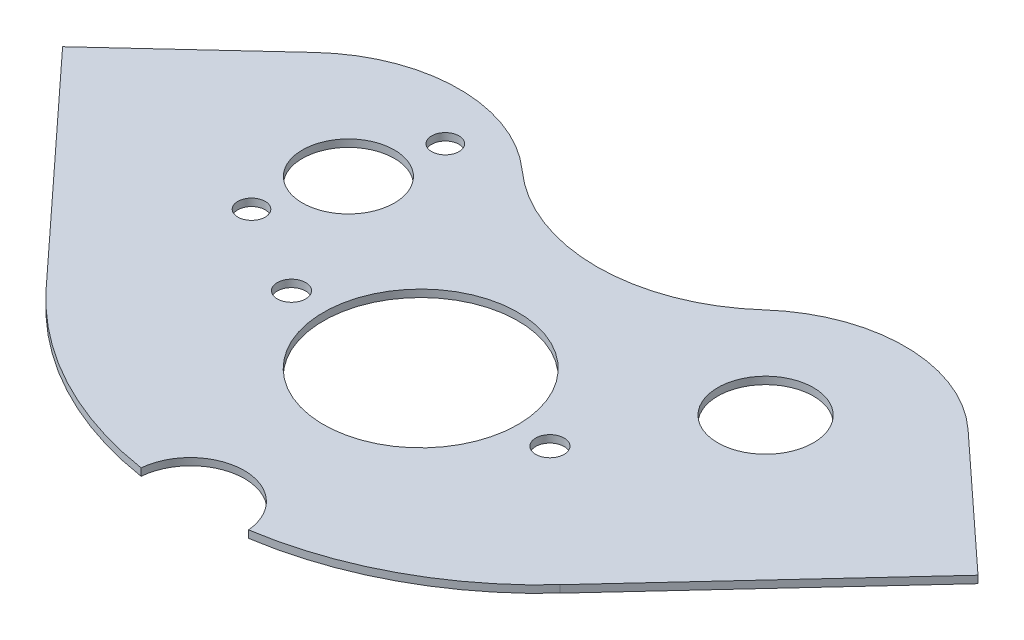
ISO-10303-21;
HEADER;
FILE_DESCRIPTION(('STEP AP214'),'2;1');
FILE_NAME('part.step','',(''),(''),'','','');
FILE_SCHEMA(('AUTOMOTIVE_DESIGN { 1 0 10303 214 1 1 1 1 }'));
ENDSEC;
DATA;
#1=APPLICATION_CONTEXT('core data for automotive mechanical design processes');
#2=APPLICATION_PROTOCOL_DEFINITION('international standard','automotive_design',2000,#1);
#3=PRODUCT_CONTEXT('',#1,'mechanical');
#4=PRODUCT('Part','Part','',(#3));
#5=PRODUCT_RELATED_PRODUCT_CATEGORY('part','',(#4));
#6=PRODUCT_DEFINITION_FORMATION('','',#4);
#7=PRODUCT_DEFINITION_CONTEXT('part definition',#1,'design');
#8=PRODUCT_DEFINITION('design','',#6,#7);
#9=PRODUCT_DEFINITION_SHAPE('','',#8);
#10=(LENGTH_UNIT() NAMED_UNIT(*) SI_UNIT(.MILLI.,.METRE.));
#11=(NAMED_UNIT(*) PLANE_ANGLE_UNIT() SI_UNIT($,.RADIAN.));
#12=(NAMED_UNIT(*) SI_UNIT($,.STERADIAN.) SOLID_ANGLE_UNIT());
#13=UNCERTAINTY_MEASURE_WITH_UNIT(LENGTH_MEASURE(1.E-05),#10,'distance_accuracy_value','');
#14=(GEOMETRIC_REPRESENTATION_CONTEXT(3) GLOBAL_UNCERTAINTY_ASSIGNED_CONTEXT((#13)) GLOBAL_UNIT_ASSIGNED_CONTEXT((#10,
#11,#12)) REPRESENTATION_CONTEXT('',''));
#15=CARTESIAN_POINT('',(0.,0.,0.));
#16=DIRECTION('',(0.,0.,1.));
#17=DIRECTION('',(1.,0.,0.));
#18=AXIS2_PLACEMENT_3D('',#15,#16,#17);
#19=CARTESIAN_POINT('',(-53.8377327101962,0.,-81.7271601363231));
#20=DIRECTION('',(0.,-1.,0.));
#21=DIRECTION('',(0.,0.,-1.));
#22=AXIS2_PLACEMENT_3D('',#19,#20,#21);
#23=PLANE('',#22);
#24=CARTESIAN_POINT('',(-44.0412566940763,0.,-105.547587553228));
#25=DIRECTION('',(0.,-1.,0.));
#26=DIRECTION('',(0.,0.,-1.));
#27=AXIS2_PLACEMENT_3D('',#24,#25,#26);
#28=CIRCLE('',#27,3.30200000000001);
#29=CARTESIAN_POINT('',(-44.0412566940763,0.,-108.849587553228));
#30=VERTEX_POINT('',#29);
#31=EDGE_CURVE('E539',#30,#30,#28,.T.);
#32=ORIENTED_EDGE('',*,*,#31,.F.);
#33=EDGE_LOOP('',(#32));
#34=FACE_BOUND('',#33,.T.);
#35=CARTESIAN_POINT('',(-31.8702602118754,0.,-56.2179716068308));
#36=DIRECTION('',(0.,-1.,0.));
#37=DIRECTION('',(0.,0.,-1.));
#38=AXIS2_PLACEMENT_3D('',#35,#36,#37);
#39=CIRCLE('',#38,3.42899999999999);
#40=CARTESIAN_POINT('',(-31.8702602118754,0.,-59.6469716068308));
#41=VERTEX_POINT('',#40);
#42=EDGE_CURVE('E196',#41,#41,#39,.F.);
#43=ORIENTED_EDGE('',*,*,#42,.T.);
#44=EDGE_LOOP('',(#43));
#45=FACE_BOUND('',#44,.T.);
#46=CARTESIAN_POINT('',(0.,0.,-55.5625));
#47=DIRECTION('',(0.,1.,0.));
#48=DIRECTION('',(1.,0.,0.));
#49=AXIS2_PLACEMENT_3D('',#46,#47,#48);
#50=CIRCLE('',#49,23.495);
#51=CARTESIAN_POINT('',(23.495,0.,-55.5625));
#52=VERTEX_POINT('',#51);
#53=EDGE_CURVE('E131',#52,#52,#50,.T.);
#54=ORIENTED_EDGE('',*,*,#53,.T.);
#55=EDGE_LOOP('',(#54));
#56=FACE_BOUND('',#55,.T.);
#57=CARTESIAN_POINT('',(0.,0.,0.0228184233947739));
#58=DIRECTION('',(0.,-1.,0.));
#59=DIRECTION('',(0.,0.,-1.));
#60=AXIS2_PLACEMENT_3D('',#57,#58,#59);
#61=ELLIPSE('',#60,13.0403184233948,13.0175);
#62=CARTESIAN_POINT('',(-12.977150257409,0.,-1.00312398810599));
#63=VERTEX_POINT('',#62);
#64=CARTESIAN_POINT('',(12.9772534174101,0.,-1.00181369621306));
#65=VERTEX_POINT('',#64);
#66=EDGE_CURVE('E163',#63,#65,#61,.T.);
#67=ORIENTED_EDGE('',*,*,#66,.F.);
#68=CARTESIAN_POINT('',(0.00426678692969085,0.,-84.4977440571273));
#69=DIRECTION('',(0.,-1.,0.));
#70=DIRECTION('',(1.,0.,0.));
#71=AXIS2_PLACEMENT_3D('',#68,#69,#70);
#72=CIRCLE('',#71,84.4977441648549);
#73=CARTESIAN_POINT('',(-62.0509434836258,0.,-27.147768928742));
#74=VERTEX_POINT('',#73);
#75=EDGE_CURVE('E154',#63,#74,#72,.T.);
#76=ORIENTED_EDGE('',*,*,#75,.T.);
#77=DIRECTION('',(-0.678819706413153,0.,-0.734304981724325));
#78=VECTOR('',#77,1.);
#79=CARTESIAN_POINT('',(-110.561503513838,0.,-79.6234786936275));
#80=LINE('',#79,#78);
#81=CARTESIAN_POINT('',(-110.561503513838,0.,-79.6234786936275));
#82=VERTEX_POINT('',#81);
#83=EDGE_CURVE('E157',#74,#82,#80,.T.);
#84=ORIENTED_EDGE('',*,*,#83,.T.);
#85=DIRECTION('',(0.734359649141192,0.,-0.678760565820691));
#86=VECTOR('',#85,1.);
#87=CARTESIAN_POINT('',(-110.561503513838,0.,-79.6234786936275));
#88=LINE('',#87,#86);
#89=CARTESIAN_POINT('',(-78.9226869412316,0.,-108.866889689634));
#90=VERTEX_POINT('',#89);
#91=EDGE_CURVE('E139',#82,#90,#88,.T.);
#92=ORIENTED_EDGE('',*,*,#91,.T.);
#93=CARTESIAN_POINT('',(-53.8377327101962,0.,-81.7271601363231));
#94=DIRECTION('',(0.,-1.,0.));
#95=DIRECTION('',(1.,0.,0.));
#96=AXIS2_PLACEMENT_3D('',#93,#94,#95);
#97=CIRCLE('',#96,36.957);
#98=CARTESIAN_POINT('',(-29.1885942519924,0.,-109.263314956274));
#99=VERTEX_POINT('',#98);
#100=EDGE_CURVE('E134',#90,#99,#97,.T.);
#101=ORIENTED_EDGE('',*,*,#100,.T.);
#102=CARTESIAN_POINT('',(0.,0.,-141.870606755233));
#103=DIRECTION('',(0.,1.,0.));
#104=DIRECTION('',(1.,0.,0.));
#105=AXIS2_PLACEMENT_3D('',#102,#103,#104);
#106=CIRCLE('',#105,43.7631067552326);
#107=CARTESIAN_POINT('',(29.1885942519924,0.,-109.263314956274));
#108=VERTEX_POINT('',#107);
#109=EDGE_CURVE('E138',#99,#108,#106,.T.);
#110=ORIENTED_EDGE('',*,*,#109,.T.);
#111=CARTESIAN_POINT('',(53.8377327101962,0.,-81.7271601363231));
#112=DIRECTION('',(0.,-1.,0.));
#113=DIRECTION('',(1.,0.,0.));
#114=AXIS2_PLACEMENT_3D('',#111,#112,#113);
#115=CIRCLE('',#114,36.957);
#116=CARTESIAN_POINT('',(78.9226869412315,0.,-108.866889689634));
#117=VERTEX_POINT('',#116);
#118=EDGE_CURVE('E143',#108,#117,#115,.T.);
#119=ORIENTED_EDGE('',*,*,#118,.T.);
#120=DIRECTION('',(0.734359649141192,0.,0.678760565820691));
#121=VECTOR('',#120,1.);
#122=CARTESIAN_POINT('',(110.561879070579,0.,-79.6231315706523));
#123=LINE('',#122,#121);
#124=CARTESIAN_POINT('',(110.561879070579,0.,-79.6231315706523));
#125=VERTEX_POINT('',#124);
#126=EDGE_CURVE('E147',#117,#125,#123,.T.);
#127=ORIENTED_EDGE('',*,*,#126,.T.);
#128=DIRECTION('',(-0.678760565820691,0.,0.734359649141193));
#129=VECTOR('',#128,1.);
#130=CARTESIAN_POINT('',(62.053684867492,0.,-27.1415021578113));
#131=LINE('',#130,#129);
#132=CARTESIAN_POINT('',(62.053684867492,0.,-27.1415021578113));
#133=VERTEX_POINT('',#132);
#134=EDGE_CURVE('E151',#125,#133,#131,.T.);
#135=ORIENTED_EDGE('',*,*,#134,.T.);
#136=EDGE_CURVE('E103',#133,#65,#72,.T.);
#137=ORIENTED_EDGE('',*,*,#136,.T.);
#138=EDGE_LOOP('',(#67,#76,#84,#92,#101,#110,#119,#127,#135,#137));
#139=FACE_BOUND('',#138,.T.);
#140=CARTESIAN_POINT('',(-48.8950000000001,0.,-86.9949999999999));
#141=DIRECTION('',(0.,-1.,0.));
#142=DIRECTION('',(1.,0.,0.));
#143=AXIS2_PLACEMENT_3D('',#140,#141,#142);
#144=CIRCLE('',#143,11.1125);
#145=CARTESIAN_POINT('',(-37.7825000000001,0.,-86.9949999999999));
#146=VERTEX_POINT('',#145);
#147=EDGE_CURVE('E201',#146,#146,#144,.T.);
#148=ORIENTED_EDGE('',*,*,#147,.F.);
#149=EDGE_LOOP('',(#148));
#150=FACE_BOUND('',#149,.T.);
#151=CARTESIAN_POINT('',(51.4349999999999,0.,-87.4395000000001));
#152=DIRECTION('',(0.,-1.,0.));
#153=DIRECTION('',(1.,0.,0.));
#154=AXIS2_PLACEMENT_3D('',#151,#152,#153);
#155=CIRCLE('',#154,11.557);
#156=CARTESIAN_POINT('',(62.9919999999999,0.,-87.4395000000001));
#157=VERTEX_POINT('',#156);
#158=EDGE_CURVE('E179',#157,#157,#155,.T.);
#159=ORIENTED_EDGE('',*,*,#158,.F.);
#160=EDGE_LOOP('',(#159));
#161=FACE_BOUND('',#160,.T.);
#162=CARTESIAN_POINT('',(31.8702602118752,0.,-54.9070283931695));
#163=DIRECTION('',(0.,1.,0.));
#164=DIRECTION('',(1.,0.,0.));
#165=AXIS2_PLACEMENT_3D('',#162,#163,#164);
#166=CIRCLE('',#165,3.42900000000003);
#167=CARTESIAN_POINT('',(35.2992602118752,0.,-54.9070283931695));
#168=VERTEX_POINT('',#167);
#169=EDGE_CURVE('E180',#168,#168,#166,.T.);
#170=ORIENTED_EDGE('',*,*,#169,.T.);
#171=EDGE_LOOP('',(#170));
#172=FACE_BOUND('',#171,.T.);
#173=CARTESIAN_POINT('',(-53.748743305924,0.,-68.4424124467718));
#174=DIRECTION('',(0.,-1.,0.));
#175=DIRECTION('',(0.,0.,-1.));
#176=AXIS2_PLACEMENT_3D('',#173,#174,#175);
#177=CIRCLE('',#176,3.30200000000001);
#178=CARTESIAN_POINT('',(-53.748743305924,0.,-71.7444124467718));
#179=VERTEX_POINT('',#178);
#180=EDGE_CURVE('E550',#179,#179,#177,.F.);
#181=ORIENTED_EDGE('',*,*,#180,.T.);
#182=EDGE_LOOP('',(#181));
#183=FACE_BOUND('',#182,.T.);
#184=ADVANCED_FACE('F15',(#34,#45,#56,#139,#150,#161,#172,#183),#23,.T.);
#185=CARTESIAN_POINT('',(-53.8377327101962,1.778,-81.7271601363231));
#186=DIRECTION('',(0.,-1.,0.));
#187=DIRECTION('',(0.,0.,-1.));
#188=AXIS2_PLACEMENT_3D('',#185,#186,#187);
#189=PLANE('',#188);
#190=CARTESIAN_POINT('',(-44.0412566940763,1.778,-105.547587553228));
#191=DIRECTION('',(0.,1.,0.));
#192=DIRECTION('',(0.678819706413153,0.,0.734304981724325));
#193=AXIS2_PLACEMENT_3D('',#190,#191,#192);
#194=CIRCLE('',#193,3.30200000000001);
#195=CARTESIAN_POINT('',(-41.7997940235,1.778,-103.122912503575));
#196=VERTEX_POINT('',#195);
#197=EDGE_CURVE('E542',#196,#196,#194,.T.);
#198=ORIENTED_EDGE('',*,*,#197,.F.);
#199=EDGE_LOOP('',(#198));
#200=FACE_BOUND('',#199,.T.);
#201=CARTESIAN_POINT('',(31.8702602118752,1.778,-54.9070283931695));
#202=DIRECTION('',(0.,-1.,0.));
#203=DIRECTION('',(0.,0.,-1.));
#204=AXIS2_PLACEMENT_3D('',#201,#202,#203);
#205=CIRCLE('',#204,3.42900000000003);
#206=CARTESIAN_POINT('',(31.8702602118752,1.778,-58.3360283931695));
#207=VERTEX_POINT('',#206);
#208=EDGE_CURVE('E177',#207,#207,#205,.F.);
#209=ORIENTED_EDGE('',*,*,#208,.F.);
#210=EDGE_LOOP('',(#209));
#211=FACE_BOUND('',#210,.T.);
#212=CARTESIAN_POINT('',(51.4349999999999,1.778,-87.4395000000001));
#213=DIRECTION('',(0.,-1.,0.));
#214=DIRECTION('',(1.,0.,0.));
#215=AXIS2_PLACEMENT_3D('',#212,#213,#214);
#216=CIRCLE('',#215,11.557);
#217=CARTESIAN_POINT('',(62.9919999999999,1.778,-87.4395000000001));
#218=VERTEX_POINT('',#217);
#219=EDGE_CURVE('E185',#218,#218,#216,.T.);
#220=ORIENTED_EDGE('',*,*,#219,.T.);
#221=EDGE_LOOP('',(#220));
#222=FACE_BOUND('',#221,.T.);
#223=CARTESIAN_POINT('',(-48.8950000000001,1.778,-86.9949999999999));
#224=DIRECTION('',(0.,-1.,0.));
#225=DIRECTION('',(1.,0.,0.));
#226=AXIS2_PLACEMENT_3D('',#223,#224,#225);
#227=CIRCLE('',#226,11.1125);
#228=CARTESIAN_POINT('',(-37.7825000000001,1.778,-86.9949999999999));
#229=VERTEX_POINT('',#228);
#230=EDGE_CURVE('E203',#229,#229,#227,.T.);
#231=ORIENTED_EDGE('',*,*,#230,.T.);
#232=EDGE_LOOP('',(#231));
#233=FACE_BOUND('',#232,.T.);
#234=CARTESIAN_POINT('',(0.00426678692969085,1.778,-84.4977440571273));
#235=DIRECTION('',(0.,-1.,0.));
#236=DIRECTION('',(1.,0.,0.));
#237=AXIS2_PLACEMENT_3D('',#234,#235,#236);
#238=CIRCLE('',#237,84.4977441648549);
#239=CARTESIAN_POINT('',(-12.9685403528648,1.778,-1.0017858084614));
#240=VERTEX_POINT('',#239);
#241=CARTESIAN_POINT('',(-62.0509434836258,1.778,-27.147768928742));
#242=VERTEX_POINT('',#241);
#243=EDGE_CURVE('E116',#240,#242,#238,.T.);
#244=ORIENTED_EDGE('',*,*,#243,.F.);
#245=CARTESIAN_POINT('',(0.,1.778,0.128139675640387));
#246=DIRECTION('',(0.,-1.,0.));
#247=DIRECTION('',(0.,0.,-1.));
#248=AXIS2_PLACEMENT_3D('',#245,#246,#247);
#249=ELLIPSE('',#248,13.0403184233948,13.0175);
#250=CARTESIAN_POINT('',(12.968653834394,1.778,-1.00047800947277));
#251=VERTEX_POINT('',#250);
#252=EDGE_CURVE('E9',#240,#251,#249,.T.);
#253=ORIENTED_EDGE('',*,*,#252,.T.);
#254=CARTESIAN_POINT('',(62.053684867492,1.778,-27.1415021578113));
#255=VERTEX_POINT('',#254);
#256=EDGE_CURVE('E101',#255,#251,#238,.T.);
#257=ORIENTED_EDGE('',*,*,#256,.F.);
#258=DIRECTION('',(-0.678760565820691,0.,0.734359649141193));
#259=VECTOR('',#258,1.);
#260=CARTESIAN_POINT('',(62.053684867492,1.778,-27.1415021578113));
#261=LINE('',#260,#259);
#262=CARTESIAN_POINT('',(110.561879070579,1.778,-79.6231315706523));
#263=VERTEX_POINT('',#262);
#264=EDGE_CURVE('E111',#263,#255,#261,.T.);
#265=ORIENTED_EDGE('',*,*,#264,.F.);
#266=DIRECTION('',(0.734359649141192,0.,0.678760565820691));
#267=VECTOR('',#266,1.);
#268=CARTESIAN_POINT('',(110.561879070579,1.778,-79.6231315706523));
#269=LINE('',#268,#267);
#270=CARTESIAN_POINT('',(78.9226869412315,1.778,-108.866889689634));
#271=VERTEX_POINT('',#270);
#272=EDGE_CURVE('E117',#271,#263,#269,.T.);
#273=ORIENTED_EDGE('',*,*,#272,.F.);
#274=CARTESIAN_POINT('',(53.8377327101962,1.778,-81.7271601363231));
#275=DIRECTION('',(0.,-1.,0.));
#276=DIRECTION('',(1.,0.,0.));
#277=AXIS2_PLACEMENT_3D('',#274,#275,#276);
#278=CIRCLE('',#277,36.957);
#279=CARTESIAN_POINT('',(29.1885942519924,1.778,-109.263314956274));
#280=VERTEX_POINT('',#279);
#281=EDGE_CURVE('E266',#280,#271,#278,.T.);
#282=ORIENTED_EDGE('',*,*,#281,.F.);
#283=CARTESIAN_POINT('',(0.,1.778,-141.870606755233));
#284=DIRECTION('',(0.,1.,0.));
#285=DIRECTION('',(1.,0.,0.));
#286=AXIS2_PLACEMENT_3D('',#283,#284,#285);
#287=CIRCLE('',#286,43.7631067552326);
#288=CARTESIAN_POINT('',(-29.1885942519924,1.778,-109.263314956274));
#289=VERTEX_POINT('',#288);
#290=EDGE_CURVE('E260',#289,#280,#287,.T.);
#291=ORIENTED_EDGE('',*,*,#290,.F.);
#292=CARTESIAN_POINT('',(-53.8377327101962,1.778,-81.7271601363231));
#293=DIRECTION('',(0.,-1.,0.));
#294=DIRECTION('',(1.,0.,0.));
#295=AXIS2_PLACEMENT_3D('',#292,#293,#294);
#296=CIRCLE('',#295,36.957);
#297=CARTESIAN_POINT('',(-78.9226869412316,1.778,-108.866889689634));
#298=VERTEX_POINT('',#297);
#299=EDGE_CURVE('E130',#298,#289,#296,.T.);
#300=ORIENTED_EDGE('',*,*,#299,.F.);
#301=DIRECTION('',(0.734359649141192,0.,-0.678760565820691));
#302=VECTOR('',#301,1.);
#303=CARTESIAN_POINT('',(-110.561503513838,1.778,-79.6234786936275));
#304=LINE('',#303,#302);
#305=CARTESIAN_POINT('',(-110.561503513838,1.778,-79.6234786936275));
#306=VERTEX_POINT('',#305);
#307=EDGE_CURVE('E128',#306,#298,#304,.T.);
#308=ORIENTED_EDGE('',*,*,#307,.F.);
#309=DIRECTION('',(-0.678819706413153,0.,-0.734304981724325));
#310=VECTOR('',#309,1.);
#311=CARTESIAN_POINT('',(-110.561503513838,1.778,-79.6234786936275));
#312=LINE('',#311,#310);
#313=EDGE_CURVE('E122',#242,#306,#312,.T.);
#314=ORIENTED_EDGE('',*,*,#313,.F.);
#315=EDGE_LOOP('',(#244,#253,#257,#265,#273,#282,#291,#300,#308,#314));
#316=FACE_BOUND('',#315,.T.);
#317=CARTESIAN_POINT('',(0.,1.778,-55.5625));
#318=DIRECTION('',(0.,1.,0.));
#319=DIRECTION('',(1.,0.,0.));
#320=AXIS2_PLACEMENT_3D('',#317,#318,#319);
#321=CIRCLE('',#320,23.495);
#322=CARTESIAN_POINT('',(23.495,1.778,-55.5625));
#323=VERTEX_POINT('',#322);
#324=EDGE_CURVE('E124',#323,#323,#321,.T.);
#325=ORIENTED_EDGE('',*,*,#324,.F.);
#326=EDGE_LOOP('',(#325));
#327=FACE_BOUND('',#326,.T.);
#328=CARTESIAN_POINT('',(-31.8702602118754,1.778,-56.2179716068308));
#329=DIRECTION('',(0.,-1.,0.));
#330=DIRECTION('',(0.,0.,-1.));
#331=AXIS2_PLACEMENT_3D('',#328,#329,#330);
#332=CIRCLE('',#331,3.42899999999999);
#333=CARTESIAN_POINT('',(-31.8702602118754,1.778,-59.6469716068308));
#334=VERTEX_POINT('',#333);
#335=EDGE_CURVE('E19',#334,#334,#332,.T.);
#336=ORIENTED_EDGE('',*,*,#335,.T.);
#337=EDGE_LOOP('',(#336));
#338=FACE_BOUND('',#337,.T.);
#339=CARTESIAN_POINT('',(-53.748743305924,1.778,-68.4424124467718));
#340=DIRECTION('',(0.,-1.,0.));
#341=DIRECTION('',(0.678819706413153,0.,0.734304981724325));
#342=AXIS2_PLACEMENT_3D('',#339,#340,#341);
#343=CIRCLE('',#342,3.30200000000001);
#344=CARTESIAN_POINT('',(-51.5072806353478,1.778,-66.017737397118));
#345=VERTEX_POINT('',#344);
#346=EDGE_CURVE('E546',#345,#345,#343,.T.);
#347=ORIENTED_EDGE('',*,*,#346,.T.);
#348=EDGE_LOOP('',(#347));
#349=FACE_BOUND('',#348,.T.);
#350=ADVANCED_FACE('F120',(#200,#211,#222,#233,#316,#327,#338,#349),#189,.F.);
#351=CARTESIAN_POINT('',(0.00426678692969085,1.778,-84.4977440571273));
#352=DIRECTION('',(0.,-1.,0.));
#353=DIRECTION('',(0.,0.,-1.));
#354=AXIS2_PLACEMENT_3D('',#351,#352,#353);
#355=CYLINDRICAL_SURFACE('',#354,84.4977441648549);
#356=CARTESIAN_POINT('',(-12.9685403528648,1.778,-1.0017858084614));
#357=CARTESIAN_POINT('',(-12.9700441449491,1.48166700785893,-1.00201945699263));
#358=CARTESIAN_POINT('',(-12.9715135330366,1.18533384512172,-1.00224779622862));
#359=CARTESIAN_POINT('',(-12.974383501218,0.592667178455057,-1.00269385611015));
#360=CARTESIAN_POINT('',(-12.9757840813119,0.296333674525594,-1.00291157675568));
#361=CARTESIAN_POINT('',(-12.977150257409,0.,-1.00312398810598));
#362=B_SPLINE_CURVE_WITH_KNOTS('',3,(#356,#357,#358,#359,#360,#361),.UNSPECIFIED.,.F.,.F.,(4,2,
4),(0.,0.889010681151768,1.77802136230354),.UNSPECIFIED.);
#363=EDGE_CURVE('E215',#240,#63,#362,.T.);
#364=ORIENTED_EDGE('',*,*,#363,.F.);
#365=ORIENTED_EDGE('',*,*,#243,.T.);
#366=DIRECTION('',(0.,-1.,0.));
#367=VECTOR('',#366,1.);
#368=CARTESIAN_POINT('',(-62.0509434836258,1.778,-27.147768928742));
#369=LINE('',#368,#367);
#370=EDGE_CURVE('E108',#242,#74,#369,.T.);
#371=ORIENTED_EDGE('',*,*,#370,.T.);
#372=ORIENTED_EDGE('',*,*,#75,.F.);
#373=EDGE_LOOP('',(#364,#365,#371,#372));
#374=FACE_BOUND('',#373,.T.);
#375=ADVANCED_FACE('F234',(#374),#355,.T.);
#376=CARTESIAN_POINT('',(-110.561503513838,1.778,-79.6234786936275));
#377=DIRECTION('',(-0.678760565820691,0.,-0.734359649141192));
#378=DIRECTION('',(-0.734359649141192,0.,0.678760565820691));
#379=AXIS2_PLACEMENT_3D('',#376,#377,#378);
#380=PLANE('',#379);
#381=ORIENTED_EDGE('',*,*,#91,.F.);
#382=DIRECTION('',(0.,-1.,0.));
#383=VECTOR('',#382,1.);
#384=CARTESIAN_POINT('',(-110.561503513838,1.778,-79.6234786936275));
#385=LINE('',#384,#383);
#386=EDGE_CURVE('E40',#306,#82,#385,.T.);
#387=ORIENTED_EDGE('',*,*,#386,.F.);
#388=ORIENTED_EDGE('',*,*,#307,.T.);
#389=DIRECTION('',(0.,-1.,0.));
#390=VECTOR('',#389,1.);
#391=CARTESIAN_POINT('',(-78.9226869412316,1.778,-108.866889689634));
#392=LINE('',#391,#390);
#393=EDGE_CURVE('E24',#298,#90,#392,.T.);
#394=ORIENTED_EDGE('',*,*,#393,.T.);
#395=EDGE_LOOP('',(#381,#387,#388,#394));
#396=FACE_BOUND('',#395,.T.);
#397=ADVANCED_FACE('F17',(#396),#380,.T.);
#398=CARTESIAN_POINT('',(-53.8377327101962,1.778,-81.7271601363231));
#399=DIRECTION('',(0.,-1.,0.));
#400=DIRECTION('',(0.,0.,-1.));
#401=AXIS2_PLACEMENT_3D('',#398,#399,#400);
#402=CYLINDRICAL_SURFACE('',#401,36.957);
#403=ORIENTED_EDGE('',*,*,#100,.F.);
#404=ORIENTED_EDGE('',*,*,#393,.F.);
#405=ORIENTED_EDGE('',*,*,#299,.T.);
#406=DIRECTION('',(0.,-1.,0.));
#407=VECTOR('',#406,1.);
#408=CARTESIAN_POINT('',(-29.1885942519924,1.778,-109.263314956274));
#409=LINE('',#408,#407);
#410=EDGE_CURVE('E175',#289,#99,#409,.T.);
#411=ORIENTED_EDGE('',*,*,#410,.T.);
#412=EDGE_LOOP('',(#403,#404,#405,#411));
#413=FACE_BOUND('',#412,.T.);
#414=ADVANCED_FACE('F253',(#413),#402,.T.);
#415=CARTESIAN_POINT('',(0.,1.778,-141.870606755233));
#416=DIRECTION('',(0.,-1.,0.));
#417=DIRECTION('',(0.,0.,-1.));
#418=AXIS2_PLACEMENT_3D('',#415,#416,#417);
#419=CYLINDRICAL_SURFACE('',#418,43.7631067552326);
#420=ORIENTED_EDGE('',*,*,#109,.F.);
#421=ORIENTED_EDGE('',*,*,#410,.F.);
#422=ORIENTED_EDGE('',*,*,#290,.T.);
#423=DIRECTION('',(0.,-1.,0.));
#424=VECTOR('',#423,1.);
#425=CARTESIAN_POINT('',(29.1885942519924,1.778,-109.263314956274));
#426=LINE('',#425,#424);
#427=EDGE_CURVE('E173',#280,#108,#426,.T.);
#428=ORIENTED_EDGE('',*,*,#427,.T.);
#429=EDGE_LOOP('',(#420,#421,#422,#428));
#430=FACE_BOUND('',#429,.T.);
#431=ADVANCED_FACE('F257',(#430),#419,.F.);
#432=CARTESIAN_POINT('',(53.8377327101962,1.778,-81.7271601363231));
#433=DIRECTION('',(0.,-1.,0.));
#434=DIRECTION('',(0.,0.,-1.));
#435=AXIS2_PLACEMENT_3D('',#432,#433,#434);
#436=CYLINDRICAL_SURFACE('',#435,36.957);
#437=ORIENTED_EDGE('',*,*,#118,.F.);
#438=ORIENTED_EDGE('',*,*,#427,.F.);
#439=ORIENTED_EDGE('',*,*,#281,.T.);
#440=DIRECTION('',(0.,-1.,0.));
#441=VECTOR('',#440,1.);
#442=CARTESIAN_POINT('',(78.9226869412315,1.778,-108.866889689634));
#443=LINE('',#442,#441);
#444=EDGE_CURVE('E171',#271,#117,#443,.T.);
#445=ORIENTED_EDGE('',*,*,#444,.T.);
#446=EDGE_LOOP('',(#437,#438,#439,#445));
#447=FACE_BOUND('',#446,.T.);
#448=ADVANCED_FACE('F264',(#447),#436,.T.);
#449=CARTESIAN_POINT('',(110.561879070579,1.778,-79.6231315706523));
#450=DIRECTION('',(0.678760565820691,0.,-0.734359649141192));
#451=DIRECTION('',(-0.734359649141192,0.,-0.678760565820691));
#452=AXIS2_PLACEMENT_3D('',#449,#450,#451);
#453=PLANE('',#452);
#454=ORIENTED_EDGE('',*,*,#126,.F.);
#455=ORIENTED_EDGE('',*,*,#444,.F.);
#456=ORIENTED_EDGE('',*,*,#272,.T.);
#457=DIRECTION('',(0.,-1.,0.));
#458=VECTOR('',#457,1.);
#459=CARTESIAN_POINT('',(110.561879070579,1.778,-79.6231315706523));
#460=LINE('',#459,#458);
#461=EDGE_CURVE('E107',#263,#125,#460,.T.);
#462=ORIENTED_EDGE('',*,*,#461,.T.);
#463=EDGE_LOOP('',(#454,#455,#456,#462));
#464=FACE_BOUND('',#463,.T.);
#465=ADVANCED_FACE('F268',(#464),#453,.T.);
#466=CARTESIAN_POINT('',(62.053684867492,1.778,-27.1415021578113));
#467=DIRECTION('',(0.734359649141193,0.,0.678760565820691));
#468=DIRECTION('',(0.678760565820691,0.,-0.734359649141193));
#469=AXIS2_PLACEMENT_3D('',#466,#467,#468);
#470=PLANE('',#469);
#471=ORIENTED_EDGE('',*,*,#134,.F.);
#472=ORIENTED_EDGE('',*,*,#461,.F.);
#473=ORIENTED_EDGE('',*,*,#264,.T.);
#474=DIRECTION('',(0.,-1.,0.));
#475=VECTOR('',#474,1.);
#476=CARTESIAN_POINT('',(62.053684867492,1.778,-27.1415021578113));
#477=LINE('',#476,#475);
#478=EDGE_CURVE('E97',#255,#133,#477,.T.);
#479=ORIENTED_EDGE('',*,*,#478,.T.);
#480=EDGE_LOOP('',(#471,#472,#473,#479));
#481=FACE_BOUND('',#480,.T.);
#482=ADVANCED_FACE('F112',(#481),#470,.T.);
#483=CARTESIAN_POINT('',(12.9772534174101,0.,-1.00181369621306));
#484=CARTESIAN_POINT('',(12.9758889647741,0.296333674121945,-1.00160169391919));
#485=CARTESIAN_POINT('',(12.9744901065381,0.592667177849585,-1.0013843855439));
#486=CARTESIAN_POINT('',(12.9716235788661,1.18533384451625,-1.00093915663047));
#487=CARTESIAN_POINT('',(12.9701559094301,1.48166700745528,-1.00071123609233));
#488=CARTESIAN_POINT('',(12.968653834394,1.778,-1.00047800947277));
#489=B_SPLINE_CURVE_WITH_KNOTS('',3,(#483,#484,#485,#486,#487,#488),.UNSPECIFIED.,.F.,.F.,(4,2,
4),(0.,0.889010655239373,1.77802131047875),.UNSPECIFIED.);
#490=EDGE_CURVE('E32',#65,#251,#489,.T.);
#491=ORIENTED_EDGE('',*,*,#490,.F.);
#492=ORIENTED_EDGE('',*,*,#136,.F.);
#493=ORIENTED_EDGE('',*,*,#478,.F.);
#494=ORIENTED_EDGE('',*,*,#256,.T.);
#495=EDGE_LOOP('',(#491,#492,#493,#494));
#496=FACE_BOUND('',#495,.T.);
#497=ADVANCED_FACE('F99',(#496),#355,.T.);
#498=CARTESIAN_POINT('',(0.,1.778,-55.5625));
#499=DIRECTION('',(0.,-1.,0.));
#500=DIRECTION('',(0.,0.,-1.));
#501=AXIS2_PLACEMENT_3D('',#498,#499,#500);
#502=CYLINDRICAL_SURFACE('',#501,23.495);
#503=ORIENTED_EDGE('',*,*,#324,.T.);
#504=EDGE_LOOP('',(#503));
#505=FACE_BOUND('',#504,.T.);
#506=ORIENTED_EDGE('',*,*,#53,.F.);
#507=EDGE_LOOP('',(#506));
#508=FACE_BOUND('',#507,.T.);
#509=ADVANCED_FACE('F239',(#505,#508),#502,.F.);
#510=CARTESIAN_POINT('',(-110.561503513838,1.778,-79.6234786936275));
#511=DIRECTION('',(-0.734304981724325,0.,0.678819706413153));
#512=DIRECTION('',(0.678819706413153,0.,0.734304981724325));
#513=AXIS2_PLACEMENT_3D('',#510,#511,#512);
#514=PLANE('',#513);
#515=ORIENTED_EDGE('',*,*,#83,.F.);
#516=ORIENTED_EDGE('',*,*,#370,.F.);
#517=ORIENTED_EDGE('',*,*,#313,.T.);
#518=ORIENTED_EDGE('',*,*,#386,.T.);
#519=EDGE_LOOP('',(#515,#516,#517,#518));
#520=FACE_BOUND('',#519,.T.);
#521=ADVANCED_FACE('F229',(#520),#514,.T.);
#522=CARTESIAN_POINT('',(0.,5.03121297167852,0.320846348305659));
#523=DIRECTION('',(0.,-0.998250163634514,-0.0591321469563413));
#524=DIRECTION('',(0.,0.0591321469563413,-0.998250163634514));
#525=AXIS2_PLACEMENT_3D('',#522,#523,#524);
#526=CYLINDRICAL_SURFACE('',#525,13.0175);
#527=ORIENTED_EDGE('',*,*,#66,.T.);
#528=ORIENTED_EDGE('',*,*,#490,.T.);
#529=ORIENTED_EDGE('',*,*,#252,.F.);
#530=ORIENTED_EDGE('',*,*,#363,.T.);
#531=EDGE_LOOP('',(#527,#528,#529,#530));
#532=FACE_BOUND('',#531,.T.);
#533=ADVANCED_FACE('F223',(#532),#526,.F.);
#534=CARTESIAN_POINT('',(-48.8950000000001,1.778,-86.9949999999999));
#535=DIRECTION('',(0.,-1.,0.));
#536=DIRECTION('',(0.,0.,-1.));
#537=AXIS2_PLACEMENT_3D('',#534,#535,#536);
#538=CYLINDRICAL_SURFACE('',#537,11.1125);
#539=ORIENTED_EDGE('',*,*,#230,.F.);
#540=EDGE_LOOP('',(#539));
#541=FACE_BOUND('',#540,.T.);
#542=ORIENTED_EDGE('',*,*,#147,.T.);
#543=EDGE_LOOP('',(#542));
#544=FACE_BOUND('',#543,.T.);
#545=ADVANCED_FACE('F228',(#541,#544),#538,.F.);
#546=CARTESIAN_POINT('',(51.4349999999999,1.778,-87.4395000000001));
#547=DIRECTION('',(0.,-1.,0.));
#548=DIRECTION('',(0.,0.,-1.));
#549=AXIS2_PLACEMENT_3D('',#546,#547,#548);
#550=CYLINDRICAL_SURFACE('',#549,11.557);
#551=ORIENTED_EDGE('',*,*,#219,.F.);
#552=EDGE_LOOP('',(#551));
#553=FACE_BOUND('',#552,.T.);
#554=ORIENTED_EDGE('',*,*,#158,.T.);
#555=EDGE_LOOP('',(#554));
#556=FACE_BOUND('',#555,.T.);
#557=ADVANCED_FACE('F370',(#553,#556),#550,.F.);
#558=CARTESIAN_POINT('',(31.8702602118752,79.9263286211798,-54.9070283931695));
#559=DIRECTION('',(0.,-1.,0.));
#560=DIRECTION('',(0.,0.,-1.));
#561=AXIS2_PLACEMENT_3D('',#558,#559,#560);
#562=CYLINDRICAL_SURFACE('',#561,3.42900000000003);
#563=ORIENTED_EDGE('',*,*,#169,.F.);
#564=EDGE_LOOP('',(#563));
#565=FACE_BOUND('',#564,.T.);
#566=ORIENTED_EDGE('',*,*,#208,.T.);
#567=EDGE_LOOP('',(#566));
#568=FACE_BOUND('',#567,.T.);
#569=ADVANCED_FACE('F379',(#565,#568),#562,.F.);
#570=CARTESIAN_POINT('',(-31.8702602118754,0.,-56.2179716068308));
#571=DIRECTION('',(0.,-1.,0.));
#572=DIRECTION('',(0.,0.,-1.));
#573=AXIS2_PLACEMENT_3D('',#570,#571,#572);
#574=CYLINDRICAL_SURFACE('',#573,3.42899999999999);
#575=ORIENTED_EDGE('',*,*,#42,.F.);
#576=EDGE_LOOP('',(#575));
#577=FACE_BOUND('',#576,.T.);
#578=ORIENTED_EDGE('',*,*,#335,.F.);
#579=EDGE_LOOP('',(#578));
#580=FACE_BOUND('',#579,.T.);
#581=ADVANCED_FACE('F388',(#577,#580),#574,.F.);
#582=CARTESIAN_POINT('',(-53.748743305924,-135.440737562609,-68.4424124467718));
#583=DIRECTION('',(0.,1.,0.));
#584=DIRECTION('',(0.,0.,1.));
#585=AXIS2_PLACEMENT_3D('',#582,#583,#584);
#586=CYLINDRICAL_SURFACE('',#585,3.30200000000001);
#587=ORIENTED_EDGE('',*,*,#180,.F.);
#588=EDGE_LOOP('',(#587));
#589=FACE_BOUND('',#588,.T.);
#590=ORIENTED_EDGE('',*,*,#346,.F.);
#591=EDGE_LOOP('',(#590));
#592=FACE_BOUND('',#591,.T.);
#593=ADVANCED_FACE('F399',(#589,#592),#586,.F.);
#594=CARTESIAN_POINT('',(-44.0412566940763,-135.440737562609,-105.547587553228));
#595=DIRECTION('',(0.,1.,0.));
#596=DIRECTION('',(0.,0.,1.));
#597=AXIS2_PLACEMENT_3D('',#594,#595,#596);
#598=CYLINDRICAL_SURFACE('',#597,3.30200000000001);
#599=ORIENTED_EDGE('',*,*,#31,.T.);
#600=EDGE_LOOP('',(#599));
#601=FACE_BOUND('',#600,.T.);
#602=ORIENTED_EDGE('',*,*,#197,.T.);
#603=EDGE_LOOP('',(#602));
#604=FACE_BOUND('',#603,.T.);
#605=ADVANCED_FACE('F411',(#601,#604),#598,.F.);
#606=CLOSED_SHELL('',(#184,#350,#375,#397,#414,#431,#448,#465,#482,#497,#509,#521,#533,#545,
#557,#569,#581,#593,#605));
#607=MANIFOLD_SOLID_BREP('B1',#606);
#608=ADVANCED_BREP_SHAPE_REPRESENTATION('',(#18,#607),#14);
#609=SHAPE_DEFINITION_REPRESENTATION(#9,#608);
ENDSEC;
END-ISO-10303-21;
